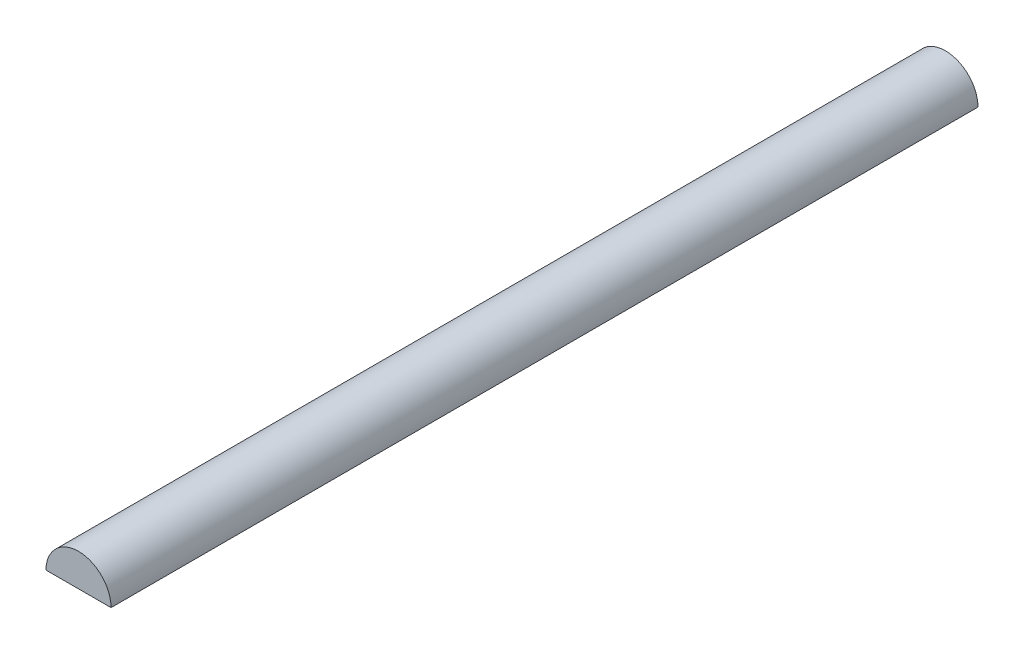
ISO-10303-21;
HEADER;
FILE_DESCRIPTION(('STEP AP214'),'2;1');
FILE_NAME('part.step','',(''),(''),'','','');
FILE_SCHEMA(('AUTOMOTIVE_DESIGN { 1 0 10303 214 1 1 1 1 }'));
ENDSEC;
DATA;
#1=APPLICATION_CONTEXT('core data for automotive mechanical design processes');
#2=APPLICATION_PROTOCOL_DEFINITION('international standard','automotive_design',2000,#1);
#3=PRODUCT_CONTEXT('',#1,'mechanical');
#4=PRODUCT('Part','Part','',(#3));
#5=PRODUCT_RELATED_PRODUCT_CATEGORY('part','',(#4));
#6=PRODUCT_DEFINITION_FORMATION('','',#4);
#7=PRODUCT_DEFINITION_CONTEXT('part definition',#1,'design');
#8=PRODUCT_DEFINITION('design','',#6,#7);
#9=PRODUCT_DEFINITION_SHAPE('','',#8);
#10=(LENGTH_UNIT() NAMED_UNIT(*) SI_UNIT(.MILLI.,.METRE.));
#11=(NAMED_UNIT(*) PLANE_ANGLE_UNIT() SI_UNIT($,.RADIAN.));
#12=(NAMED_UNIT(*) SI_UNIT($,.STERADIAN.) SOLID_ANGLE_UNIT());
#13=UNCERTAINTY_MEASURE_WITH_UNIT(LENGTH_MEASURE(1.E-05),#10,'distance_accuracy_value','');
#14=(GEOMETRIC_REPRESENTATION_CONTEXT(3) GLOBAL_UNCERTAINTY_ASSIGNED_CONTEXT((#13)) GLOBAL_UNIT_ASSIGNED_CONTEXT((#10,
#11,#12)) REPRESENTATION_CONTEXT('',''));
#15=CARTESIAN_POINT('',(0.,0.,0.));
#16=DIRECTION('',(0.,0.,1.));
#17=DIRECTION('',(1.,0.,0.));
#18=AXIS2_PLACEMENT_3D('',#15,#16,#17);
#19=CARTESIAN_POINT('',(0.,0.,20.));
#20=DIRECTION('',(0.,0.,-1.));
#21=DIRECTION('',(-1.,0.,0.));
#22=AXIS2_PLACEMENT_3D('',#19,#20,#21);
#23=CYLINDRICAL_SURFACE('',#22,0.75);
#24=CARTESIAN_POINT('',(0.,0.,20.));
#25=DIRECTION('',(0.,0.,1.));
#26=DIRECTION('',(1.,0.,0.));
#27=AXIS2_PLACEMENT_3D('',#24,#25,#26);
#28=CIRCLE('',#27,0.75);
#29=CARTESIAN_POINT('',(0.75,0.,20.));
#30=VERTEX_POINT('',#29);
#31=CARTESIAN_POINT('',(-0.75,0.,20.));
#32=VERTEX_POINT('',#31);
#33=EDGE_CURVE('E52',#30,#32,#28,.T.);
#34=ORIENTED_EDGE('',*,*,#33,.F.);
#35=DIRECTION('',(0.,0.,-1.));
#36=VECTOR('',#35,1.);
#37=CARTESIAN_POINT('',(0.75,0.,20.));
#38=LINE('',#37,#36);
#39=CARTESIAN_POINT('',(0.75,0.,0.));
#40=VERTEX_POINT('',#39);
#41=EDGE_CURVE('E63',#30,#40,#38,.T.);
#42=ORIENTED_EDGE('',*,*,#41,.T.);
#43=CARTESIAN_POINT('',(0.,0.,0.));
#44=DIRECTION('',(0.,0.,1.));
#45=DIRECTION('',(1.,0.,0.));
#46=AXIS2_PLACEMENT_3D('',#43,#44,#45);
#47=CIRCLE('',#46,0.75);
#48=CARTESIAN_POINT('',(-0.75,0.,0.));
#49=VERTEX_POINT('',#48);
#50=EDGE_CURVE('E74',#40,#49,#47,.T.);
#51=ORIENTED_EDGE('',*,*,#50,.T.);
#52=DIRECTION('',(0.,0.,-1.));
#53=VECTOR('',#52,1.);
#54=CARTESIAN_POINT('',(-0.75,0.,20.));
#55=LINE('',#54,#53);
#56=EDGE_CURVE('E59',#49,#32,#55,.F.);
#57=ORIENTED_EDGE('',*,*,#56,.T.);
#58=EDGE_LOOP('',(#34,#42,#51,#57));
#59=FACE_BOUND('',#58,.T.);
#60=ADVANCED_FACE('F44',(#59),#23,.T.);
#61=CARTESIAN_POINT('',(0.,0.,20.));
#62=DIRECTION('',(0.,0.,1.));
#63=DIRECTION('',(1.,0.,0.));
#64=AXIS2_PLACEMENT_3D('',#61,#62,#63);
#65=PLANE('',#64);
#66=DIRECTION('',(-1.,0.,0.));
#67=VECTOR('',#66,1.);
#68=CARTESIAN_POINT('',(0.,0.,20.));
#69=LINE('',#68,#67);
#70=EDGE_CURVE('E77',#30,#32,#69,.T.);
#71=ORIENTED_EDGE('',*,*,#70,.F.);
#72=ORIENTED_EDGE('',*,*,#33,.T.);
#73=EDGE_LOOP('',(#71,#72));
#74=FACE_BOUND('',#73,.T.);
#75=ADVANCED_FACE('F88',(#74),#65,.T.);
#76=CARTESIAN_POINT('',(0.,0.,0.));
#77=DIRECTION('',(0.,0.,1.));
#78=DIRECTION('',(1.,0.,0.));
#79=AXIS2_PLACEMENT_3D('',#76,#77,#78);
#80=PLANE('',#79);
#81=ORIENTED_EDGE('',*,*,#50,.F.);
#82=DIRECTION('',(-1.,0.,0.));
#83=VECTOR('',#82,1.);
#84=CARTESIAN_POINT('',(0.,0.,0.));
#85=LINE('',#84,#83);
#86=EDGE_CURVE('E11',#40,#49,#85,.T.);
#87=ORIENTED_EDGE('',*,*,#86,.T.);
#88=EDGE_LOOP('',(#81,#87));
#89=FACE_BOUND('',#88,.T.);
#90=ADVANCED_FACE('F79',(#89),#80,.F.);
#91=CARTESIAN_POINT('',(0.,0.,0.));
#92=DIRECTION('',(0.,1.,0.));
#93=DIRECTION('',(0.,0.,1.));
#94=AXIS2_PLACEMENT_3D('',#91,#92,#93);
#95=PLANE('',#94);
#96=ORIENTED_EDGE('',*,*,#70,.T.);
#97=ORIENTED_EDGE('',*,*,#56,.F.);
#98=ORIENTED_EDGE('',*,*,#86,.F.);
#99=ORIENTED_EDGE('',*,*,#41,.F.);
#100=EDGE_LOOP('',(#96,#97,#98,#99));
#101=FACE_BOUND('',#100,.T.);
#102=ADVANCED_FACE('F68',(#101),#95,.F.);
#103=CLOSED_SHELL('',(#60,#75,#90,#102));
#104=MANIFOLD_SOLID_BREP('B2',#103);
#105=ADVANCED_BREP_SHAPE_REPRESENTATION('',(#18,#104),#14);
#106=SHAPE_DEFINITION_REPRESENTATION(#9,#105);
ENDSEC;
END-ISO-10303-21;
